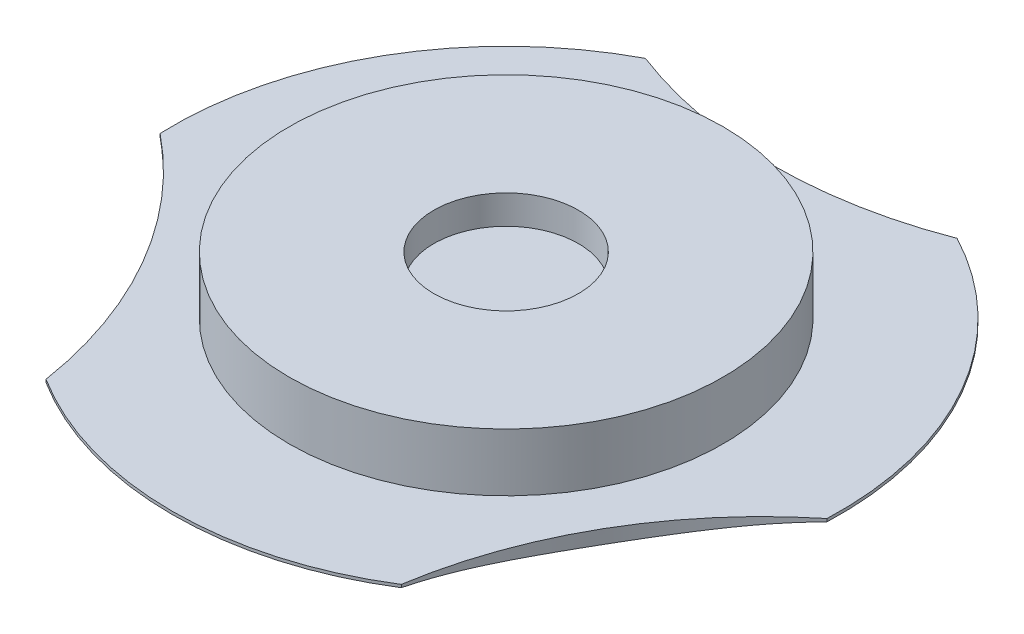
ISO-10303-21;
HEADER;
FILE_DESCRIPTION(('STEP AP214'),'2;1');
FILE_NAME('part.step','',(''),(''),'','','');
FILE_SCHEMA(('AUTOMOTIVE_DESIGN { 1 0 10303 214 1 1 1 1 }'));
ENDSEC;
DATA;
#1=APPLICATION_CONTEXT('core data for automotive mechanical design processes');
#2=APPLICATION_PROTOCOL_DEFINITION('international standard','automotive_design',2000,#1);
#3=PRODUCT_CONTEXT('',#1,'mechanical');
#4=PRODUCT('Part','Part','',(#3));
#5=PRODUCT_RELATED_PRODUCT_CATEGORY('part','',(#4));
#6=PRODUCT_DEFINITION_FORMATION('','',#4);
#7=PRODUCT_DEFINITION_CONTEXT('part definition',#1,'design');
#8=PRODUCT_DEFINITION('design','',#6,#7);
#9=PRODUCT_DEFINITION_SHAPE('','',#8);
#10=(LENGTH_UNIT() NAMED_UNIT(*) SI_UNIT(.MILLI.,.METRE.));
#11=(NAMED_UNIT(*) PLANE_ANGLE_UNIT() SI_UNIT($,.RADIAN.));
#12=(NAMED_UNIT(*) SI_UNIT($,.STERADIAN.) SOLID_ANGLE_UNIT());
#13=UNCERTAINTY_MEASURE_WITH_UNIT(LENGTH_MEASURE(1.E-05),#10,'distance_accuracy_value','');
#14=(GEOMETRIC_REPRESENTATION_CONTEXT(3) GLOBAL_UNCERTAINTY_ASSIGNED_CONTEXT((#13)) GLOBAL_UNIT_ASSIGNED_CONTEXT((#10,
#11,#12)) REPRESENTATION_CONTEXT('',''));
#15=CARTESIAN_POINT('',(0.,0.,0.));
#16=DIRECTION('',(0.,0.,1.));
#17=DIRECTION('',(1.,0.,0.));
#18=AXIS2_PLACEMENT_3D('',#15,#16,#17);
#19=CARTESIAN_POINT('',(0.,9.43352076152873,0.));
#20=DIRECTION('',(0.,1.,0.));
#21=DIRECTION('',(0.,0.,1.));
#22=AXIS2_PLACEMENT_3D('',#19,#20,#21);
#23=PLANE('',#22);
#24=CARTESIAN_POINT('',(0.,9.43352076152873,0.));
#25=DIRECTION('',(0.,1.,0.));
#26=DIRECTION('',(0.,0.,1.));
#27=AXIS2_PLACEMENT_3D('',#24,#25,#26);
#28=CIRCLE('',#27,7.5);
#29=CARTESIAN_POINT('',(0.,9.43352076152873,7.49999999999999));
#30=VERTEX_POINT('',#29);
#31=EDGE_CURVE('E255',#30,#30,#28,.T.);
#32=ORIENTED_EDGE('',*,*,#31,.F.);
#33=EDGE_LOOP('',(#32));
#34=FACE_BOUND('',#33,.T.);
#35=CARTESIAN_POINT('',(0.,9.43352076152873,0.));
#36=DIRECTION('',(0.,1.,0.));
#37=DIRECTION('',(0.,0.,1.));
#38=AXIS2_PLACEMENT_3D('',#35,#36,#37);
#39=CIRCLE('',#38,11.5356537528528);
#40=CARTESIAN_POINT('',(-11.5274658732935,9.43352076152873,0.434554997394507));
#41=VERTEX_POINT('',#40);
#42=CARTESIAN_POINT('',(-5.38739726956153,9.43352076152873,-10.2003557862276));
#43=VERTEX_POINT('',#42);
#44=EDGE_CURVE('E72',#41,#43,#39,.F.);
#45=ORIENTED_EDGE('',*,*,#44,.F.);
#46=CARTESIAN_POINT('',(-20.9573790351245,9.43352076152872,12.0997484274379));
#47=DIRECTION('',(0.,1.,0.));
#48=DIRECTION('',(0.,0.,1.));
#49=AXIS2_PLACEMENT_3D('',#46,#47,#48);
#50=CIRCLE('',#49,15.);
#51=CARTESIAN_POINT('',(-6.14006860373204,9.43352076152872,9.76580078883293));
#52=VERTEX_POINT('',#51);
#53=EDGE_CURVE('E243',#52,#41,#50,.T.);
#54=ORIENTED_EDGE('',*,*,#53,.F.);
#55=CARTESIAN_POINT('',(6.1400686037319,9.43352076152872,9.76580078883302));
#56=VERTEX_POINT('',#55);
#57=EDGE_CURVE('E183',#56,#52,#39,.F.);
#58=ORIENTED_EDGE('',*,*,#57,.F.);
#59=CARTESIAN_POINT('',(20.9573790351243,9.43352076152872,12.0997484274382));
#60=DIRECTION('',(0.,1.,0.));
#61=DIRECTION('',(0.,0.,1.));
#62=AXIS2_PLACEMENT_3D('',#59,#60,#61);
#63=CIRCLE('',#62,15.);
#64=CARTESIAN_POINT('',(11.5274658732935,9.43352076152873,0.434554997394667));
#65=VERTEX_POINT('',#64);
#66=EDGE_CURVE('E250',#65,#56,#63,.T.);
#67=ORIENTED_EDGE('',*,*,#66,.F.);
#68=CARTESIAN_POINT('',(5.38739726956153,9.43352076152873,-10.2003557862276));
#69=VERTEX_POINT('',#68);
#70=EDGE_CURVE('E188',#69,#65,#39,.F.);
#71=ORIENTED_EDGE('',*,*,#70,.F.);
#72=CARTESIAN_POINT('',(0.,9.43352076152874,-24.1994968548761));
#73=DIRECTION('',(0.,1.,0.));
#74=DIRECTION('',(0.,0.,1.));
#75=AXIS2_PLACEMENT_3D('',#72,#73,#74);
#76=CIRCLE('',#75,15.);
#77=EDGE_CURVE('E251',#43,#69,#76,.T.);
#78=ORIENTED_EDGE('',*,*,#77,.F.);
#79=EDGE_LOOP('',(#45,#54,#58,#67,#71,#78));
#80=FACE_BOUND('',#79,.T.);
#81=ADVANCED_FACE('F176',(#34,#80),#23,.T.);
#82=CARTESIAN_POINT('',(0.,45.3704428911622,0.));
#83=DIRECTION('',(0.,-1.,0.));
#84=DIRECTION('',(0.,0.,-1.));
#85=AXIS2_PLACEMENT_3D('',#82,#83,#84);
#86=CYLINDRICAL_SURFACE('',#85,7.5);
#87=ORIENTED_EDGE('',*,*,#31,.T.);
#88=EDGE_LOOP('',(#87));
#89=FACE_BOUND('',#88,.T.);
#90=CARTESIAN_POINT('',(0.,11.4335207615287,0.));
#91=DIRECTION('',(0.,1.,0.));
#92=DIRECTION('',(0.,0.,1.));
#93=AXIS2_PLACEMENT_3D('',#90,#91,#92);
#94=CIRCLE('',#93,7.5);
#95=CARTESIAN_POINT('',(0.,11.4335207615287,7.49999999999999));
#96=VERTEX_POINT('',#95);
#97=EDGE_CURVE('E294',#96,#96,#94,.T.);
#98=ORIENTED_EDGE('',*,*,#97,.F.);
#99=EDGE_LOOP('',(#98));
#100=FACE_BOUND('',#99,.T.);
#101=ADVANCED_FACE('F339',(#89,#100),#86,.T.);
#102=CARTESIAN_POINT('',(-3.11360126562325,7.937623113544,-3.13799643352642));
#103=CARTESIAN_POINT('',(-2.61542634530798,7.59724052872144,-3.13799643352642));
#104=CARTESIAN_POINT('',(-2.1172514249927,7.28839338581119,-3.13799643352642));
#105=CARTESIAN_POINT('',(-1.61907650467743,7.000845282462,-3.13799643352642));
#106=CARTESIAN_POINT('',(-0.871813057940758,6.67424847236847,-3.13799643352642));
#107=CARTESIAN_POINT('',(-0.124549611204089,6.58434688790549,-3.13799643352642));
#108=CARTESIAN_POINT('',(0.124538915217305,6.58434636163488,-3.13799643352642));
#109=CARTESIAN_POINT('',(0.871804494481487,6.67424522412291,-3.13799643352642));
#110=CARTESIAN_POINT('',(1.61907007374567,7.00084161506081,-3.13799643352642));
#111=CARTESIAN_POINT('',(2.11724712658846,7.28839070032714,-3.13799643352642));
#112=CARTESIAN_POINT('',(2.61542417943125,7.59723890276684,-3.13799643352642));
#113=CARTESIAN_POINT('',(3.11360123227403,7.93762288659672,-3.13799643352642));
#114=CARTESIAN_POINT('',(-3.11360126562325,7.59504891652239,-2.63613712455256));
#115=CARTESIAN_POINT('',(-2.61542634530798,7.19697722862648,-2.63613712455256));
#116=CARTESIAN_POINT('',(-2.1172514249927,6.83104483157861,-2.63613712455256));
#117=CARTESIAN_POINT('',(-1.61907650467743,6.48399326596545,-2.63613712455256));
#118=CARTESIAN_POINT('',(-0.871813057940758,6.08575802622804,-2.63613712455256));
#119=CARTESIAN_POINT('',(-0.124549611204089,5.9758528199001,-2.63613712455256));
#120=CARTESIAN_POINT('',(0.124538915217305,5.97585217939156,-2.63613712455256));
#121=CARTESIAN_POINT('',(0.871804494481487,6.085754074874,-2.63613712455256));
#122=CARTESIAN_POINT('',(1.61907007374567,6.48398876309058,-2.63613712455256));
#123=CARTESIAN_POINT('',(2.11724712658846,6.83104156445317,-2.63613712455256));
#124=CARTESIAN_POINT('',(2.61542417943125,7.19697532553092,-2.63613712455256));
#125=CARTESIAN_POINT('',(3.11360123227403,7.59504871584649,-2.63613712455256));
#126=CARTESIAN_POINT('',(-3.11360126562325,7.28142877047209,-2.1342778155787));
#127=CARTESIAN_POINT('',(-2.61542634530798,6.82613744470199,-2.1342778155787));
#128=CARTESIAN_POINT('',(-2.1172514249927,6.40393719997495,-2.1342778155787));
#129=CARTESIAN_POINT('',(-1.61907650467743,5.99571298774634,-2.1342778155787));
#130=CARTESIAN_POINT('',(-0.871813057940758,5.52287934500352,-2.1342778155787));
#131=CARTESIAN_POINT('',(-0.124549611204089,5.39216567050666,-2.1342778155787));
#132=CARTESIAN_POINT('',(0.124538915217305,5.39216493134301,-2.1342778155787));
#133=CARTESIAN_POINT('',(0.871804494481487,5.52287465308459,-2.1342778155787));
#134=CARTESIAN_POINT('',(1.61907007374567,5.99570762777393,-2.1342778155787));
#135=CARTESIAN_POINT('',(2.11724712658846,6.40393337351171,-2.1342778155787));
#136=CARTESIAN_POINT('',(2.61542417943125,6.82613526882366,-2.1342778155787));
#137=CARTESIAN_POINT('',(3.11360123227403,7.28142868013361,-2.1342778155787));
#138=CARTESIAN_POINT('',(-3.11360126562325,6.98662054266186,-1.63241850660484));
#139=CARTESIAN_POINT('',(-2.61542634530798,6.47112654113163,-1.63241850660484));
#140=CARTESIAN_POINT('',(-2.1172514249927,5.98724363827097,-1.63241850660484));
#141=CARTESIAN_POINT('',(-1.61907650467743,5.51234872423166,-1.63241850660484));
#142=CARTESIAN_POINT('',(-0.871813057940758,4.97060643439688,-1.63241850660484));
#143=CARTESIAN_POINT('',(-0.124549611204089,4.81849264631775,-1.63241850660484));
#144=CARTESIAN_POINT('',(0.124538915217305,4.8184917534154,-1.63241850660484));
#145=CARTESIAN_POINT('',(0.871804494481487,4.97060105523037,-1.63241850660484));
#146=CARTESIAN_POINT('',(1.61907007374567,5.51234239088727,-1.63241850660484));
#147=CARTESIAN_POINT('',(2.11724712658846,5.98723938606817,-1.63241850660484));
#148=CARTESIAN_POINT('',(2.61542417943125,6.47112451840757,-1.63241850660484));
#149=CARTESIAN_POINT('',(3.11360123227403,6.98662079092823,-1.63241850660484));
#150=CARTESIAN_POINT('',(-3.11360126562325,6.64957359545626,-0.879629543144051));
#151=CARTESIAN_POINT('',(-2.61542634530798,6.06063612358645,-0.879629543144051));
#152=CARTESIAN_POINT('',(-2.1172514249927,5.50094406891031,-0.879629543144051));
#153=CARTESIAN_POINT('',(-1.61907650467743,4.95519001196715,-0.879629543144051));
#154=CARTESIAN_POINT('',(-0.871813057940758,4.28175912783596,-0.879629543144051));
#155=CARTESIAN_POINT('',(-0.124549611204089,4.08986241601543,-0.879629543144051));
#156=CARTESIAN_POINT('',(0.124538915217305,4.08986133013182,-0.879629543144051));
#157=CARTESIAN_POINT('',(0.871804494481487,4.28175220249054,-0.879629543144051));
#158=CARTESIAN_POINT('',(1.61907007374567,4.95518272245078,-0.879629543144051));
#159=CARTESIAN_POINT('',(2.11724712658846,5.50093942186458,-0.879629543144051));
#160=CARTESIAN_POINT('',(2.61542417943125,6.06063354280388,-0.879629543144051));
#161=CARTESIAN_POINT('',(3.11360123227403,6.64957347075905,-0.879629543144051));
#162=CARTESIAN_POINT('',(-3.11360126562325,6.55618552691207,-0.126840579683261));
#163=CARTESIAN_POINT('',(-2.61542634530798,5.94527238698926,-0.126840579683261));
#164=CARTESIAN_POINT('',(-2.1172514249927,5.36268776447394,-0.126840579683261));
#165=CARTESIAN_POINT('',(-1.61907650467743,4.79383981524938,-0.126840579683261));
#166=CARTESIAN_POINT('',(-0.871813057940758,4.07694026263187,-0.126840579683261));
#167=CARTESIAN_POINT('',(-0.124549611204089,3.85473666423939,-0.126840579683261));
#168=CARTESIAN_POINT('',(0.124538915217305,3.85473528796918,-0.126840579683261));
#169=CARTESIAN_POINT('',(0.871804494481487,4.076932728122,-0.126840579683261));
#170=CARTESIAN_POINT('',(1.61907007374567,4.79383232042963,-0.126840579683261));
#171=CARTESIAN_POINT('',(2.11724712658846,5.36268272794387,-0.126840579683261));
#172=CARTESIAN_POINT('',(2.61542417943125,5.94526974853238,-0.126840579683261));
#173=CARTESIAN_POINT('',(3.11360123227403,6.55618549533082,-0.126840579683261));
#174=CARTESIAN_POINT('',(-3.11360126562325,6.55609684157066,0.124089074803669));
#175=CARTESIAN_POINT('',(-2.61542634530798,5.94454426095569,0.124089074803669));
#176=CARTESIAN_POINT('',(-2.1172514249927,5.36136717941806,0.124089074803669));
#177=CARTESIAN_POINT('',(-1.61907650467743,4.79169409054885,0.124089074803669));
#178=CARTESIAN_POINT('',(-0.871813057940758,4.07382722363082,0.124089074803669));
#179=CARTESIAN_POINT('',(-0.12454961120409,3.85057259866754,0.124089074803669));
#180=CARTESIAN_POINT('',(0.124538915217305,3.85057120605239,0.124089074803669));
#181=CARTESIAN_POINT('',(0.871804494481487,4.07381969315282,0.124089074803669));
#182=CARTESIAN_POINT('',(1.61907007374567,4.79168655148878,0.124089074803669));
#183=CARTESIAN_POINT('',(2.11724712658846,5.3613621883294,0.124089074803669));
#184=CARTESIAN_POINT('',(2.61542417943125,5.9445416145618,0.124089074803669));
#185=CARTESIAN_POINT('',(3.11360123227403,6.55609678045078,0.124089074803669));
#186=CARTESIAN_POINT('',(-3.11360126562325,6.64904351904959,0.872889284920727));
#187=CARTESIAN_POINT('',(-2.61542634530798,6.05571108757478,0.872889284920727));
#188=CARTESIAN_POINT('',(-2.1172514249927,5.49137521736159,0.872889284920727));
#189=CARTESIAN_POINT('',(-1.61907650467743,4.94103491973095,0.872889284920727));
#190=CARTESIAN_POINT('',(-0.871813057940759,4.25944945414356,0.872889284920727));
#191=CARTESIAN_POINT('',(-0.12454961120409,4.06465095540626,0.872889284920727));
#192=CARTESIAN_POINT('',(0.124538915217304,4.0646498509368,0.872889284920727));
#193=CARTESIAN_POINT('',(0.871804494481487,4.25944241788699,0.872889284920727));
#194=CARTESIAN_POINT('',(1.61907007374567,4.94102761372968,0.872889284920727));
#195=CARTESIAN_POINT('',(2.11724712658846,5.49137032788645,0.872889284920727));
#196=CARTESIAN_POINT('',(2.61542417943125,6.05570854726112,0.872889284920727));
#197=CARTESIAN_POINT('',(3.11360123227403,6.64904352911799,0.872889284920727));
#198=CARTESIAN_POINT('',(-3.11360126562325,6.98719030370924,1.62168949503779));
#199=CARTESIAN_POINT('',(-2.61542634530798,6.46364643369561,1.62168949503779));
#200=CARTESIAN_POINT('',(-2.1172514249927,5.97167244969741,1.62168949503779));
#201=CARTESIAN_POINT('',(-1.61907650467743,5.48791800590051,1.62168949503779));
#202=CARTESIAN_POINT('',(-0.871813057940759,4.93506358972752,1.62168949503779));
#203=CARTESIAN_POINT('',(-0.12454961120409,4.77983457477378,1.62168949503779));
#204=CARTESIAN_POINT('',(0.124538915217304,4.77983367764913,1.62168949503779));
#205=CARTESIAN_POINT('',(0.871804494481487,4.93505809335462,1.62168949503779));
#206=CARTESIAN_POINT('',(1.61907007374567,5.48791156889603,1.62168949503779));
#207=CARTESIAN_POINT('',(2.11724712658846,5.97166821206818,1.62168949503779));
#208=CARTESIAN_POINT('',(2.61542417943125,6.4636440919047,1.62168949503779));
#209=CARTESIAN_POINT('',(3.11360123227403,6.98719018323561,1.62168949503779));
#210=CARTESIAN_POINT('',(-3.11360126562325,7.28489337990906,2.11956005066791));
#211=CARTESIAN_POINT('',(-2.61542634530798,6.81975043868102,2.11956005066791));
#212=CARTESIAN_POINT('',(-2.1172514249927,6.38786250149728,2.11956005066791));
#213=CARTESIAN_POINT('',(-1.61907650467743,5.9695906499434,2.11956005066791));
#214=CARTESIAN_POINT('',(-0.871813057940759,5.48507831255403,2.11956005066791));
#215=CARTESIAN_POINT('',(-0.12454961120409,5.35084375184689,2.11956005066791));
#216=CARTESIAN_POINT('',(0.124538915217304,5.35084292262855,2.11956005066791));
#217=CARTESIAN_POINT('',(0.871804494481487,5.48507350251821,2.11956005066791));
#218=CARTESIAN_POINT('',(1.61907007374567,5.96958525618739,2.11956005066791));
#219=CARTESIAN_POINT('',(2.11724712658846,6.38785879381362,2.11956005066791));
#220=CARTESIAN_POINT('',(2.61542417943125,6.81974844659845,2.11956005066791));
#221=CARTESIAN_POINT('',(3.11360123227403,7.28489327877417,2.11956005066791));
#222=CARTESIAN_POINT('',(-3.11360126562325,7.60726055939484,2.61743060629804));
#223=CARTESIAN_POINT('',(-2.61542634530798,7.19820793893451,2.61743060629804));
#224=CARTESIAN_POINT('',(-2.1172514249927,6.82157727797017,2.61743060629804));
#225=CARTESIAN_POINT('',(-1.61907650467743,6.46382083777974,2.61743060629804));
#226=CARTESIAN_POINT('',(-0.871813057940758,6.05295368857926,2.61743060629804));
#227=CARTESIAN_POINT('',(-0.12454961120409,5.93951638039541,2.61743060629804));
#228=CARTESIAN_POINT('',(0.124538915217305,5.93951570863097,2.61743060629804));
#229=CARTESIAN_POINT('',(0.871804494481487,6.05294930250404,2.61743060629804));
#230=CARTESIAN_POINT('',(1.61907007374567,6.46381624962606,2.61743060629804));
#231=CARTESIAN_POINT('',(2.11724712658846,6.82157422303054,2.61743060629804));
#232=CARTESIAN_POINT('',(2.61542417943125,7.19820630738128,2.61743060629804));
#233=CARTESIAN_POINT('',(3.11360123227403,7.60726059904454,2.61743060629804));
#234=CARTESIAN_POINT('',(-3.11360126562325,7.96463019577989,3.11530116192817));
#235=CARTESIAN_POINT('',(-2.61542634530798,7.61225486290375,3.11530116192817));
#236=CARTESIAN_POINT('',(-2.1172514249927,7.29183034804258,3.11530116192817));
#237=CARTESIAN_POINT('',(-1.61907650467743,6.99324917863655,3.11530116192817));
#238=CARTESIAN_POINT('',(-0.871813057940758,6.65382722284382,3.11530116192817));
#239=CARTESIAN_POINT('',(-0.124549611204089,6.56046039965776,3.11530116192817));
#240=CARTESIAN_POINT('',(0.124538915217305,6.56045982966153,3.11530116192817));
#241=CARTESIAN_POINT('',(0.871804494481487,6.65382337659068,3.11530116192817));
#242=CARTESIAN_POINT('',(1.61907007374567,6.99324513593723,3.11530116192817));
#243=CARTESIAN_POINT('',(2.11724712658846,7.29182791148918,3.11530116192817));
#244=CARTESIAN_POINT('',(2.61542417943125,7.6122535860403,3.11530116192817));
#245=CARTESIAN_POINT('',(3.11360123227403,7.96463036922525,3.11530116192817));
#246=B_SPLINE_SURFACE_WITH_KNOTS('',5,5,((#102,#103,#104,#105,#106,#107,#108,#109,#110,#111,
#112,#113),(#114,#115,#116,#117,#118,#119,#120,#121,#122,#123,#124,#125),(#126,#127,#128,#129,
#130,#131,#132,#133,#134,#135,#136,#137),(#138,#139,#140,#141,#142,#143,#144,#145,#146,#147,
#148,#149),(#150,#151,#152,#153,#154,#155,#156,#157,#158,#159,#160,#161),(#162,#163,#164,#165,
#166,#167,#168,#169,#170,#171,#172,#173),(#174,#175,#176,#177,#178,#179,#180,#181,#182,#183,
#184,#185),(#186,#187,#188,#189,#190,#191,#192,#193,#194,#195,#196,#197),(#198,#199,#200,#201,
#202,#203,#204,#205,#206,#207,#208,#209),(#210,#211,#212,#213,#214,#215,#216,#217,#218,#219,
#220,#221),(#222,#223,#224,#225,#226,#227,#228,#229,#230,#231,#232,#233),(#234,#235,#236,#237,
#238,#239,#240,#241,#242,#243,#244,#245)),.UNSPECIFIED.,.F.,.F.,.F.,(6,3,3,6),(6,3,3,6),
(-2.99588678556527,-0.486590240695972,0.768058031738678,3.25741080988932),(-3.11360126562325,
-0.622726664046877,0.622715968060093,3.11360123227403),.UNSPECIFIED.);
#247=CARTESIAN_POINT('',(-6.94502371193992E-11,6.43361939260252,3.00015914966676));
#248=CARTESIAN_POINT('',(-0.168369170775696,6.43362383102677,3.00015646468615));
#249=CARTESIAN_POINT('',(-0.336880059908865,6.43370980999841,2.98608167683183));
#250=CARTESIAN_POINT('',(-0.669220786115052,6.4336910015602,2.9295517235223));
#251=CARTESIAN_POINT('',(-0.833044431640659,6.43358597267979,2.88706067740758));
#252=CARTESIAN_POINT('',(-1.15131328393748,6.43355621421522,2.77547176266421));
#253=CARTESIAN_POINT('',(-1.30576084611601,6.43363143915491,2.70638060865471));
#254=CARTESIAN_POINT('',(-1.60086526166447,6.433813151013,2.54331745740612));
#255=CARTESIAN_POINT('',(-1.74152699255679,6.43391962682098,2.44935430391519));
#256=CARTESIAN_POINT('',(-2.00544094374606,6.4340440157865,2.23872522279229));
#257=CARTESIAN_POINT('',(-2.12863265052798,6.43406162808246,2.12198355826804));
#258=CARTESIAN_POINT('',(-2.35353370996981,6.43399608798819,1.86923991601341));
#259=CARTESIAN_POINT('',(-2.45524058455651,6.43391292398181,1.73323571955002));
#260=CARTESIAN_POINT('',(-2.58910740509711,6.43376334503043,1.51853637696536));
#261=CARTESIAN_POINT('',(-2.63050890355568,6.43370956246539,1.44544397841132));
#262=CARTESIAN_POINT('',(-2.70707883089785,6.43361878736176,1.29603577714827));
#263=CARTESIAN_POINT('',(-2.74224697966097,6.43358179557763,1.21971982976695));
#264=CARTESIAN_POINT('',(-2.8061144923863,6.43354658811171,1.06443578443451));
#265=CARTESIAN_POINT('',(-2.83481389827214,6.43354837217862,0.985467703675555));
#266=CARTESIAN_POINT('',(-2.88556035475395,6.43359694530224,0.825423843270878));
#267=CARTESIAN_POINT('',(-2.90760782317445,6.43364373153149,0.744348196354168));
#268=CARTESIAN_POINT('',(-2.94494205571929,6.43369590411284,0.57982445203915));
#269=CARTESIAN_POINT('',(-2.96016114337415,6.43370088434751,0.496360967700022));
#270=CARTESIAN_POINT('',(-2.98343141041526,6.43368067229352,0.328437177996661));
#271=CARTESIAN_POINT('',(-2.9914820779879,6.43365547785073,0.243976801892132));
#272=CARTESIAN_POINT('',(-3.00043799162693,6.43362629140429,0.0746859250085986));
#273=CARTESIAN_POINT('',(-3.00134377699354,6.4336222978004,-0.010144547351685));
#274=CARTESIAN_POINT('',(-2.99601348476975,6.43364069694652,-0.179577268130175));
#275=CARTESIAN_POINT('',(-2.98977776693827,6.43366308836737,-0.264179527829582));
#276=CARTESIAN_POINT('',(-2.97020828984775,6.43369960736705,-0.432085946574098));
#277=CARTESIAN_POINT('',(-2.95691410035748,6.4337137801021,-0.515394703292947));
#278=CARTESIAN_POINT('',(-2.92326982957729,6.43368445389916,-0.680575335776372));
#279=CARTESIAN_POINT('',(-2.90291963896245,6.43364095406756,-0.762447189257069));
#280=CARTESIAN_POINT('',(-2.85543582486922,6.43357852626571,-0.924202810711122));
#281=CARTESIAN_POINT('',(-2.82830172745974,6.43355960001277,-1.00408643935603));
#282=CARTESIAN_POINT('',(-2.767460936624,6.43355959906242,-1.16131058073196));
#283=CARTESIAN_POINT('',(-2.73375416881041,6.43357852479344,-1.23865106466893));
#284=CARTESIAN_POINT('',(-2.6599248012581,6.43363495279813,-1.39033292215802));
#285=CARTESIAN_POINT('',(-2.61979428743556,6.4336724781077,-1.46467045271417));
#286=CARTESIAN_POINT('',(-2.53342412553487,6.43374583027833,-1.60968088216829));
#287=CARTESIAN_POINT('',(-2.48718461178627,6.43378165717672,-1.68035386159777));
#288=CARTESIAN_POINT('',(-2.33976745848653,6.43386854350985,-1.88606877407902));
#289=CARTESIAN_POINT('',(-2.22981213923912,6.43389912756561,-2.01496891587683));
#290=CARTESIAN_POINT('',(-1.98997076544583,6.43388747287063,-2.25209813061941));
#291=CARTESIAN_POINT('',(-1.86012748319679,6.43384538845571,-2.36037047152253));
#292=CARTESIAN_POINT('',(-1.65324506966376,6.43374435323986,-2.50520759683785));
#293=CARTESIAN_POINT('',(-1.58222435561476,6.43370432586084,-2.55057720211393));
#294=CARTESIAN_POINT('',(-1.43660189050449,6.43362560105556,-2.63519879666057));
#295=CARTESIAN_POINT('',(-1.36200003685486,6.43358690366745,-2.67445061053875));
#296=CARTESIAN_POINT('',(-1.20977690174887,6.43353229448477,-2.74657027202948));
#297=CARTESIAN_POINT('',(-1.13215555255035,6.4335163832017,-2.77943797631578));
#298=CARTESIAN_POINT('',(-0.974445240211905,6.43352711865217,-2.8385929432336));
#299=CARTESIAN_POINT('',(-0.89435632217277,6.43355376460833,-2.86488032605641));
#300=CARTESIAN_POINT('',(-0.732262239419173,6.43362610623149,-2.91065349587264));
#301=CARTESIAN_POINT('',(-0.650257241494113,6.4336718002462,-2.93013987253867));
#302=CARTESIAN_POINT('',(-0.484884654489438,6.43370375186627,-2.96205165670812));
#303=CARTESIAN_POINT('',(-0.401517076376356,6.43369000994976,-2.97447712101154));
#304=CARTESIAN_POINT('',(-0.233844016177246,6.43365819843116,-2.99228539772667));
#305=CARTESIAN_POINT('',(-0.149536831747488,6.433640119054,-2.9976521226327));
#306=CARTESIAN_POINT('',(0.0192331728791341,6.43362837747091,-3.0012991180094));
#307=CARTESIAN_POINT('',(0.103695998473748,6.43363471612838,-2.99957913790199));
#308=CARTESIAN_POINT('',(0.272188501261583,6.43366444058375,-2.98905172388241));
#309=CARTESIAN_POINT('',(0.356218137385125,6.43368782796913,-2.98024362996207));
#310=CARTESIAN_POINT('',(0.523221351606214,6.4336959385228,-2.9555135588791));
#311=CARTESIAN_POINT('',(0.606194985864221,6.43368066375594,-2.93959196166763));
#312=CARTESIAN_POINT('',(0.77031600539346,6.43361746182137,-2.90080068871673));
#313=CARTESIAN_POINT('',(0.851466845422279,6.43356960297129,-2.87794560559383));
#314=CARTESIAN_POINT('',(1.01158499881486,6.43351833648994,-2.82555652758814));
#315=CARTESIAN_POINT('',(1.09055218251607,6.43351493149263,-2.79602213704876));
#316=CARTESIAN_POINT('',(1.24575164558354,6.43354118725682,-2.7304565824644));
#317=CARTESIAN_POINT('',(1.32198387157045,6.43357084866333,-2.69442529169923));
#318=CARTESIAN_POINT('',(1.47113703606307,6.43364253975297,-2.61611173383177));
#319=CARTESIAN_POINT('',(1.54405811955472,6.43368456889395,-2.57382974077648));
#320=CARTESIAN_POINT('',(1.75789628963021,6.43379884023082,-2.43744141731617));
#321=CARTESIAN_POINT('',(1.89309867163244,6.43385872101653,-2.33412600645003));
#322=CARTESIAN_POINT('',(2.14397518658921,6.43390691114347,-2.10615071433049));
#323=CARTESIAN_POINT('',(2.25965099157898,6.43389522661594,-1.98149266246259));
#324=CARTESIAN_POINT('',(2.46741310128317,6.43380198766058,-1.71547426474254));
#325=CARTESIAN_POINT('',(2.55967979579334,6.43372098996606,-1.57425472195432));
#326=CARTESIAN_POINT('',(2.71934573085664,6.43358786317583,-1.27829957310436));
#327=CARTESIAN_POINT('',(2.78674205149007,6.43353573746949,-1.12356238263174));
#328=CARTESIAN_POINT('',(2.86804808108599,6.43359059929686,-0.88439678823389));
#329=CARTESIAN_POINT('',(2.89189820028409,6.43363142336946,-0.803215062104474));
#330=CARTESIAN_POINT('',(2.93263033377643,6.43368961151593,-0.63910244014185));
#331=CARTESIAN_POINT('',(2.9495127743549,6.43370697702516,-0.55617165164308));
#332=CARTESIAN_POINT('',(2.97613782598099,6.43369792549036,-0.389186214165083));
#333=CARTESIAN_POINT('',(2.9858815629239,6.43367151535265,-0.30513174453976));
#334=CARTESIAN_POINT('',(2.99826790029465,6.43363342825057,-0.136519724864124));
#335=CARTESIAN_POINT('',(3.00090991587101,6.43362175249966,-0.0519621339546855));
#336=CARTESIAN_POINT('',(2.99817080252219,6.43363769780586,0.201047403282739));
#337=CARTESIAN_POINT('',(2.98223263948975,6.43371578232951,0.369524086389343));
#338=CARTESIAN_POINT('',(2.92202396406839,6.43367861211234,0.701263946940477));
#339=CARTESIAN_POINT('',(2.87774883780424,6.43356332588158,0.864526270827875));
#340=CARTESIAN_POINT('',(2.76273458109817,6.43354281165466,1.18149375109606));
#341=CARTESIAN_POINT('',(2.69198958418181,6.43363763024663,1.33519678005265));
#342=CARTESIAN_POINT('',(2.52573167655752,6.4338365954944,1.6285447522828));
#343=CARTESIAN_POINT('',(2.43022391139332,6.43394074020936,1.76819260777212));
#344=CARTESIAN_POINT('',(2.21673760501513,6.43405246809654,2.02972516685341));
#345=CARTESIAN_POINT('',(2.09870120686194,6.43405979915759,2.15156267613183));
#346=CARTESIAN_POINT('',(1.84370527168266,6.43397885181704,2.3735607470722));
#347=CARTESIAN_POINT('',(1.70673868195518,6.43389053769728,2.47371319380807));
#348=CARTESIAN_POINT('',(1.41870609626607,6.433699362297,2.64900246012069));
#349=CARTESIAN_POINT('',(1.2677311363148,6.43359659297405,2.72428804741727));
#350=CARTESIAN_POINT('',(1.0337429076892,6.43356193238631,2.81759645740828));
#351=CARTESIAN_POINT('',(0.954502245154836,6.43357028645818,2.84542715649324));
#352=CARTESIAN_POINT('',(0.793990048328266,6.4336236516749,2.89440959854277));
#353=CARTESIAN_POINT('',(0.7127191335733,6.43366865176643,2.91556335276689));
#354=CARTESIAN_POINT('',(0.527163258784683,6.43371128839331,2.95552900873719));
#355=CARTESIAN_POINT('',(0.422426322443649,6.4336934305232,2.97227599211699));
#356=CARTESIAN_POINT('',(0.211811624638008,6.43364608635444,2.99459190908999));
#357=CARTESIAN_POINT('',(0.105933862796739,6.43361660005194,3.00016083899247));
#358=CARTESIAN_POINT('',(-6.94502371193992E-11,6.43361939260252,3.00015914966676));
#359=B_SPLINE_CURVE_WITH_KNOTS('',3,(#247,#248,#249,#250,#251,#252,#253,#254,#255,#256,#257,
#258,#259,#260,#261,#262,#263,#264,#265,#266,#267,#268,#269,#270,#271,#272,#273,#274,#275,#276,
#277,#278,#279,#280,#281,#282,#283,#284,#285,#286,#287,#288,#289,#290,#291,#292,#293,#294,#295,
#296,#297,#298,#299,#300,#301,#302,#303,#304,#305,#306,#307,#308,#309,#310,#311,#312,#313,#314,
#315,#316,#317,#318,#319,#320,#321,#322,#323,#324,#325,#326,#327,#328,#329,#330,#331,#332,#333,
#334,#335,#336,#337,#338,#339,#340,#341,#342,#343,#344,#345,#346,#347,#348,#349,#350,#351,#352,
#353,#354,#355,#356,#357,#358),.UNSPECIFIED.,.T.,.F.,(4,2,2,2,2,2,2,2,2,2,2,2,2,2,2,2,2,2,2,2,2,
2,2,2,2,2,2,2,2,2,2,2,2,2,2,2,2,2,2,2,2,2,2,2,2,2,2,2,2,2,2,2,2,2,2,4),(0.,0.504723124935217,
1.01008476031984,1.51531891169458,2.02037365749019,2.52713720458864,3.03395917021713,
3.28572917315788,3.53751048752236,3.78929017005622,4.04105403439574,4.29526082045904,
4.54948575502081,4.80369150033989,5.05788444040514,5.31066719260193,5.56345386156314,
5.81625819541266,6.06906539058499,6.32218647708965,6.57530199869233,7.08099854655981,
7.58562239905072,7.83819871533201,8.09078227145099,8.34337149753414,8.59595610967301,
8.84851881634047,9.10107949129303,9.354214783159,9.60735902568674,9.86052684241325,
10.1136811383884,10.3663062846735,10.618946399426,10.8715914423849,11.1242254120131,
11.6320320201322,12.1397951233548,12.6435176748761,13.1472993474142,13.4008907080642,
13.6544665516344,13.9080023933558,14.1615591139968,14.6666089740455,15.1717410881467,
15.676985220235,16.1821244498705,16.6885788473215,17.1952224424719,17.6987776608386,
17.9504963712117,18.2021391852144,18.5196988217225,18.8372585630813),.UNSPECIFIED.);
#360=CARTESIAN_POINT('',(-6.94502371193992E-11,6.43361939260252,3.00015914966676));
#361=VERTEX_POINT('',#360);
#362=EDGE_CURVE('E237',#361,#361,#359,.T.);
#363=ORIENTED_EDGE('',*,*,#362,.T.);
#364=EDGE_LOOP('',(#363));
#365=FACE_BOUND('',#364,.T.);
#366=ADVANCED_FACE('F178',(#365),#246,.F.);
#367=CARTESIAN_POINT('',(20.9573790351243,45.3704428911622,12.0997484274382));
#368=DIRECTION('',(0.,-1.,0.));
#369=DIRECTION('',(0.,0.,-1.));
#370=AXIS2_PLACEMENT_3D('',#367,#368,#369);
#371=CYLINDRICAL_SURFACE('',#370,15.);
#372=DIRECTION('',(0.,1.,0.));
#373=VECTOR('',#372,1.);
#374=CARTESIAN_POINT('',(11.5274658732935,9.43352076152872,0.434554997394667));
#375=LINE('',#374,#373);
#376=CARTESIAN_POINT('',(11.5274658732935,9.33326950366107,0.434554997394667));
#377=VERTEX_POINT('',#376);
#378=EDGE_CURVE('E314',#65,#377,#375,.F.);
#379=ORIENTED_EDGE('',*,*,#378,.F.);
#380=ORIENTED_EDGE('',*,*,#66,.T.);
#381=DIRECTION('',(0.,1.,0.));
#382=VECTOR('',#381,1.);
#383=CARTESIAN_POINT('',(6.1400686037319,9.43352076152872,9.76580078883302));
#384=LINE('',#383,#382);
#385=CARTESIAN_POINT('',(6.1400686037319,9.33326950366107,9.76580078883303));
#386=VERTEX_POINT('',#385);
#387=EDGE_CURVE('E203',#386,#56,#384,.T.);
#388=ORIENTED_EDGE('',*,*,#387,.F.);
#389=CARTESIAN_POINT('',(6.0262839147282,9.39244979725994,13.5358537528528));
#390=CARTESIAN_POINT('',(6.01128961449766,9.40198489494914,13.3799697800387));
#391=CARTESIAN_POINT('',(5.99873045992406,9.40978818762599,13.2237626009109));
#392=CARTESIAN_POINT('',(5.97850785361815,9.42207628700767,12.9109114596059));
#393=CARTESIAN_POINT('',(5.97084407531528,9.4265613150771,12.7542675272649));
#394=CARTESIAN_POINT('',(5.95524081957254,9.4352529600441,12.2842474385515));
#395=CARTESIAN_POINT('',(5.95466220555217,9.4347128608842,11.9705001691947));
#396=CARTESIAN_POINT('',(5.97314644565783,9.42258997276146,11.3442003404481));
#397=CARTESIAN_POINT('',(5.99218752844789,9.41101942499124,11.0316468422596));
#398=CARTESIAN_POINT('',(6.0497178646465,9.37902434872686,10.4087427404569));
#399=CARTESIAN_POINT('',(6.08821159851632,9.35859778061048,10.0983926610554));
#400=CARTESIAN_POINT('',(6.19300239295282,9.30740819313663,9.42604547103153));
#401=CARTESIAN_POINT('',(6.26303633272641,9.27545084923699,9.06471984677453));
#402=CARTESIAN_POINT('',(6.42937113388596,9.20841693686163,8.3484506663943));
#403=CARTESIAN_POINT('',(6.5256757724867,9.17333992032693,7.99350803584976));
#404=CARTESIAN_POINT('',(6.74403544247583,9.10635348720617,7.2918825146135));
#405=CARTESIAN_POINT('',(6.8660490826604,9.07443909881937,6.94518733229255));
#406=CARTESIAN_POINT('',(7.06809492240461,9.0335364632275,6.43215743894857));
#407=CARTESIAN_POINT('',(7.13861911622986,9.0210632165406,6.26230655319823));
#408=CARTESIAN_POINT('',(7.28593966015845,8.99909528286948,5.92515705225083));
#409=CARTESIAN_POINT('',(7.36273546551659,8.98960033753939,5.75785821688042));
#410=CARTESIAN_POINT('',(7.53328921451398,8.97308385984993,5.40366857527308));
#411=CARTESIAN_POINT('',(7.62793747241729,8.96656924469757,5.21718167659707));
#412=CARTESIAN_POINT('',(7.82499982928813,8.95856260270069,4.84824139845565));
#413=CARTESIAN_POINT('',(7.92741405747023,8.95707065944496,4.66578808616859));
#414=CARTESIAN_POINT('',(8.13978463447986,8.95922328791004,4.30532493502681));
#415=CARTESIAN_POINT('',(8.24974193932872,8.96286851187193,4.12731566333079));
#416=CARTESIAN_POINT('',(8.47692219961346,8.97501920919147,3.77617173807198));
#417=CARTESIAN_POINT('',(8.59414516016357,8.98352468597024,3.6030370879405));
#418=CARTESIAN_POINT('',(8.8359346199284,9.00479720455913,3.26150867500639));
#419=CARTESIAN_POINT('',(8.96052092773012,9.01757621653025,3.09312968573713));
#420=CARTESIAN_POINT('',(9.21647337855296,9.0464802784466,2.76192464594341));
#421=CARTESIAN_POINT('',(9.34783966038926,9.06260539692142,2.5990987092272));
#422=CARTESIAN_POINT('',(9.75180541421736,9.11438956103154,2.11927239707273));
#423=CARTESIAN_POINT('',(10.0343083176563,9.15346123770393,1.81087197088273));
#424=CARTESIAN_POINT('',(10.5672198216793,9.22390372823269,1.27576970626853));
#425=CARTESIAN_POINT('',(10.8133460824933,9.25530987479146,1.04476518793413));
#426=CARTESIAN_POINT('',(11.3208791691144,9.31341728025744,0.599676324140031));
#427=CARTESIAN_POINT('',(11.5822788266523,9.34012072303703,0.385584150421994));
#428=CARTESIAN_POINT('',(11.9844825320344,9.37370461295173,0.0782903885080129));
#429=CARTESIAN_POINT('',(12.1199344780521,9.38380597523135,-0.0216346919544864));
#430=CARTESIAN_POINT('',(12.3942385833853,9.40148951138146,-0.216946146628558));
#431=CARTESIAN_POINT('',(12.5330906455817,9.40907175711676,-0.312332650249148));
#432=CARTESIAN_POINT('',(12.8141653017897,9.42135535120843,-0.498525818957988));
#433=CARTESIAN_POINT('',(12.9563912414775,9.42605370415365,-0.589327632562548));
#434=CARTESIAN_POINT('',(13.2438903981042,9.43225091934366,-0.766120836592149));
#435=CARTESIAN_POINT('',(13.3891639423973,9.43374943608728,-0.852111706581225));
#436=CARTESIAN_POINT('',(13.5358537528528,9.43349435916257,-0.935625080237196));
#437=B_SPLINE_CURVE_WITH_KNOTS('',3,(#389,#390,#391,#392,#393,#394,#395,#396,#397,#398,#399,
#400,#401,#402,#403,#404,#405,#406,#407,#408,#409,#410,#411,#412,#413,#414,#415,#416,#417,#418,
#419,#420,#421,#422,#423,#424,#425,#426,#427,#428,#429,#430,#431,#432,#433,#434,#435,#436),
.UNSPECIFIED.,.F.,.F.,(4,2,2,2,2,2,2,2,2,2,2,2,2,2,2,2,2,2,2,2,2,2,2,4),(0.,0.470619701152225,
0.941208003982719,1.88153293904296,2.82081554883227,3.76031459897942,4.8675464620346,
5.97493760745103,7.08055930533499,7.63343486814766,8.18626245977543,8.81371750435827,
9.44118299118312,10.0687281514195,10.6962737533835,11.3255920404338,11.9549232174463,
13.213396330837,14.229744819355,15.2456200775337,15.7514018113945,16.2571691151839,
16.7634608589577,17.2698072666372),.UNSPECIFIED.);
#438=EDGE_CURVE('E263',#386,#377,#437,.T.);
#439=ORIENTED_EDGE('',*,*,#438,.T.);
#440=EDGE_LOOP('',(#379,#380,#388,#439));
#441=FACE_BOUND('',#440,.T.);
#442=ADVANCED_FACE('F278',(#441),#371,.F.);
#443=CARTESIAN_POINT('',(0.,-10.5664792384713,0.));
#444=DIRECTION('',(0.,-1.,0.));
#445=DIRECTION('',(0.,0.,-1.));
#446=AXIS2_PLACEMENT_3D('',#443,#444,#445);
#447=DEGENERATE_TOROIDAL_SURFACE('',#446,13.5356537528528,20.,.T.);
#448=ORIENTED_EDGE('',*,*,#362,.F.);
#449=EDGE_LOOP('',(#448));
#450=FACE_BOUND('',#449,.T.);
#451=CARTESIAN_POINT('',(10.5492519067785,9.10216507754264,-13.5358537528528));
#452=CARTESIAN_POINT('',(10.4196381332204,9.13550199790529,-13.4076229378361));
#453=CARTESIAN_POINT('',(10.2873429856801,9.16624605541725,-13.2814303954038));
#454=CARTESIAN_POINT('',(10.0176312640631,9.22258497097764,-13.0334509092939));
#455=CARTESIAN_POINT('',(9.88021478554323,9.24817992504406,-12.9116638834991));
#456=CARTESIAN_POINT('',(9.60058543430057,9.29424381142763,-12.6728952989181));
#457=CARTESIAN_POINT('',(9.45837565390807,9.31471597944092,-12.5559107459927));
#458=CARTESIAN_POINT('',(9.16936447001432,9.35064963248176,-12.3269757630454));
#459=CARTESIAN_POINT('',(9.02256308626996,9.3661111390661,-12.2150253113677));
#460=CARTESIAN_POINT('',(8.57902909086977,9.4048760727272,-11.8895979201907));
#461=CARTESIAN_POINT('',(8.27595253953302,9.42108052615837,-11.6838004210504));
#462=CARTESIAN_POINT('',(7.65528695056308,9.43606390848218,-11.2948154725115));
#463=CARTESIAN_POINT('',(7.33769718281878,9.43484195974708,-11.1116291623252));
#464=CARTESIAN_POINT('',(6.70796723370944,9.41808973626429,-10.7785036099803));
#465=CARTESIAN_POINT('',(6.39647432216132,9.40334336560324,-10.6272960789982));
#466=CARTESIAN_POINT('',(5.76436966061166,9.36370452608107,-10.3470030358248));
#467=CARTESIAN_POINT('',(5.44375836016478,9.33881255661424,-10.2179164352248));
#468=CARTESIAN_POINT('',(4.79403728735316,9.28270331014631,-9.98200740851277));
#469=CARTESIAN_POINT('',(4.46490689442212,9.2514691253455,-9.87524607725875));
#470=CARTESIAN_POINT('',(3.80010864153879,9.18742272037668,-9.68471994100087));
#471=CARTESIAN_POINT('',(3.46443939547524,9.15461016340963,-9.60096006994615));
#472=CARTESIAN_POINT('',(2.92607479508093,9.10530621441321,-9.48623937584818));
#473=CARTESIAN_POINT('',(2.72507705503129,9.08762339648746,-9.447687734558));
#474=CARTESIAN_POINT('',(2.32148933978956,9.05461727644876,-9.37881592744455));
#475=CARTESIAN_POINT('',(2.11889950871216,9.03929376330139,-9.34849502521506));
#476=CARTESIAN_POINT('',(1.71244560063294,9.01199898808737,-9.29615791457013));
#477=CARTESIAN_POINT('',(1.50858166862984,9.00002735141583,-9.27414077803232));
#478=CARTESIAN_POINT('',(1.09991987655065,8.98025475374082,-9.23847276133268));
#479=CARTESIAN_POINT('',(0.895122033311515,8.97245371784542,-9.22482173093912));
#480=CARTESIAN_POINT('',(0.485323579938981,8.96158915026025,-9.20594930859799));
#481=CARTESIAN_POINT('',(0.28032375773818,8.95851839818469,-9.20071506858119));
#482=CARTESIAN_POINT('',(-0.129733049816132,8.95731589300701,-9.19865660290702));
#483=CARTESIAN_POINT('',(-0.334790035382246,8.95918415852594,-9.20183240895714));
#484=CARTESIAN_POINT('',(-0.744519597853767,8.96772495180648,-9.21658274207776));
#485=CARTESIAN_POINT('',(-0.949192139861776,8.97439789640129,-9.22815799784894));
#486=CARTESIAN_POINT('',(-1.35769013693965,8.99206050925082,-9.25966231196921));
#487=CARTESIAN_POINT('',(-1.56151559420691,9.00305016630063,-9.27959134863436));
#488=CARTESIAN_POINT('',(-2.14323875012523,9.03963523449607,-9.34851232653273));
#489=CARTESIAN_POINT('',(-2.51968945027597,9.06965388087832,-9.40774696629386));
#490=CARTESIAN_POINT('',(-3.26643582500449,9.13562571335014,-9.55452215816042));
#491=CARTESIAN_POINT('',(-3.63673111735009,9.17157926647539,-9.6420644612334));
#492=CARTESIAN_POINT('',(-4.37020768568145,9.24241225541388,-9.84518542052436));
#493=CARTESIAN_POINT('',(-4.7333789004277,9.27729020705774,-9.96080101992879));
#494=CARTESIAN_POINT('',(-5.45041028370441,9.33954857113857,-10.219574051222));
#495=CARTESIAN_POINT('',(-5.80427207670879,9.36693029959997,-10.3627266412396));
#496=CARTESIAN_POINT('',(-6.4752496031121,9.40745212828504,-10.6644909670929));
#497=CARTESIAN_POINT('',(-6.79316117515014,9.4214865632214,-10.821209148212));
#498=CARTESIAN_POINT('',(-7.41739021201302,9.43544678768799,-11.1569551031887));
#499=CARTESIAN_POINT('',(-7.72370659952352,9.43537126945784,-11.3359849434332));
#500=CARTESIAN_POINT('',(-8.32193983287572,9.41881036088346,-11.7146906546087));
#501=CARTESIAN_POINT('',(-8.61388591264247,9.40235986454804,-11.9143218146943));
#502=CARTESIAN_POINT('',(-9.18184679623579,9.35161185482936,-12.3328210870011));
#503=CARTESIAN_POINT('',(-9.45787016695338,9.3173240398448,-12.5516786918454));
#504=CARTESIAN_POINT('',(-9.86764082961118,9.25046239613574,-12.9006106011706));
#505=CARTESIAN_POINT('',(-10.0077717928861,9.22452956400638,-13.024554876784));
#506=CARTESIAN_POINT('',(-10.2826026407827,9.16734530258553,-13.276911700553));
#507=CARTESIAN_POINT('',(-10.4173070651221,9.13609843819004,-13.4053203390052));
#508=CARTESIAN_POINT('',(-10.5492519067785,9.10216507754264,-13.5358537528528));
#509=B_SPLINE_CURVE_WITH_KNOTS('',3,(#451,#452,#453,#454,#455,#456,#457,#458,#459,#460,#461,
#462,#463,#464,#465,#466,#467,#468,#469,#470,#471,#472,#473,#474,#475,#476,#477,#478,#479,#480,
#481,#482,#483,#484,#485,#486,#487,#488,#489,#490,#491,#492,#493,#494,#495,#496,#497,#498,#499,
#500,#501,#502,#503,#504,#505,#506,#507,#508),.UNSPECIFIED.,.F.,.F.,(4,2,2,2,2,2,2,2,2,2,2,2,2,
2,2,2,2,2,2,2,2,2,2,2,2,2,2,2,4),(0.,0.555995351612703,1.11198033433006,1.66761324975189,
2.22324377470765,3.32177682276673,4.42036519529733,5.45904468519275,6.49767305459863,
7.53910755461702,8.58076527430078,9.19687951747383,9.81293861857372,10.4289288415501,
11.0449080027505,11.6599459878962,12.2749862918562,12.8900799604877,13.5051720325282,
14.6506329431888,15.7961647197714,16.9432122128366,18.0900582028351,19.1531157875124,
20.2162719001765,21.2771673361283,22.337486550389,22.9039105997348,23.469850510946),.UNSPECIFIED.);
#510=CARTESIAN_POINT('',(5.38739726956153,9.33326950366261,-10.2003557862276));
#511=VERTEX_POINT('',#510);
#512=CARTESIAN_POINT('',(-5.38739726956153,9.33326950366107,-10.2003557862276));
#513=VERTEX_POINT('',#512);
#514=EDGE_CURVE('E285',#511,#513,#509,.T.);
#515=ORIENTED_EDGE('',*,*,#514,.F.);
#516=CARTESIAN_POINT('',(0.,9.33326950366107,0.));
#517=DIRECTION('',(0.,-1.,0.));
#518=DIRECTION('',(0.,0.,-1.));
#519=AXIS2_PLACEMENT_3D('',#516,#517,#518);
#520=CIRCLE('',#519,11.5356537528528);
#521=EDGE_CURVE('E316',#511,#377,#520,.T.);
#522=ORIENTED_EDGE('',*,*,#521,.T.);
#523=ORIENTED_EDGE('',*,*,#438,.F.);
#524=CARTESIAN_POINT('',(-6.14006860373204,9.33326950366108,9.76580078883294));
#525=VERTEX_POINT('',#524);
#526=EDGE_CURVE('E246',#386,#525,#520,.T.);
#527=ORIENTED_EDGE('',*,*,#526,.T.);
#528=CARTESIAN_POINT('',(-13.5358537528528,9.43349435916257,-0.935625080237395));
#529=CARTESIAN_POINT('',(-13.3659172911982,9.433795056774,-0.838878483686897));
#530=CARTESIAN_POINT('',(-13.197885308191,9.43173503879835,-0.738807015943126));
#531=CARTESIAN_POINT('',(-12.8659616572516,9.42338563335505,-0.532240237211796));
#532=CARTESIAN_POINT('',(-12.7020693049024,9.41709694983715,-0.425745998114401));
#533=CARTESIAN_POINT('',(-12.3789010400508,9.40079221584161,-0.206663857577548));
#534=CARTESIAN_POINT('',(-12.2196196279679,9.3907808211539,-0.0940837171101051));
#535=CARTESIAN_POINT('',(-11.9057170303421,9.36763171769261,0.137080704883299));
#536=CARTESIAN_POINT('',(-11.7510960365341,9.35449388049083,0.255665232900302));
#537=CARTESIAN_POINT('',(-11.2935486284366,9.31128174542444,0.620942157785956));
#538=CARTESIAN_POINT('',(-10.9979524876653,9.27746787115756,0.876469725835763));
#539=CARTESIAN_POINT('',(-10.4277394652969,9.2063050835396,1.40960270948643));
#540=CARTESIAN_POINT('',(-10.1531318979197,9.1689546170073,1.68721781674227));
#541=CARTESIAN_POINT('',(-9.61784661629643,9.09711455246691,2.27238850415113));
#542=CARTESIAN_POINT('',(-9.35787346575193,9.06275101283601,2.58060905415671));
#543=CARTESIAN_POINT('',(-8.9868773914155,9.020420250458,3.05830157368573));
#544=CARTESIAN_POINT('',(-8.86637771193814,9.00784611804654,3.22008495690166));
#545=CARTESIAN_POINT('',(-8.63188000541215,8.98656956218052,3.5485625062423));
#546=CARTESIAN_POINT('',(-8.51788190549947,8.97786709532825,3.71525661730008));
#547=CARTESIAN_POINT('',(-8.29689418388372,8.96495354763921,4.05284027383183));
#548=CARTESIAN_POINT('',(-8.189888815984,8.96073202484108,4.22371911185203));
#549=CARTESIAN_POINT('',(-7.98283164655821,8.95704020911025,4.56969128982553));
#550=CARTESIAN_POINT('',(-7.88277984292266,8.95756991473617,4.74478462850026));
#551=CARTESIAN_POINT('',(-7.68984003265293,8.96334357935982,5.09881603933083));
#552=CARTESIAN_POINT('',(-7.59695263983549,8.96858794180354,5.27775443923988));
#553=CARTESIAN_POINT('',(-7.41853260547959,8.98342348548562,5.6390799758317));
#554=CARTESIAN_POINT('',(-7.33299996038351,8.99301466462133,5.82146711084621));
#555=CARTESIAN_POINT('',(-7.17354854959461,9.01531644043797,6.18007288443233));
#556=CARTESIAN_POINT('',(-7.09926178628442,9.02784555809773,6.356139429812));
#557=CARTESIAN_POINT('',(-6.95752837383414,9.05550415920866,6.71080947231931));
#558=CARTESIAN_POINT('',(-6.89008240866317,9.07063390227356,6.8894132210949));
#559=CARTESIAN_POINT('',(-6.69810892746706,9.11867737105686,7.42868768109231));
#560=CARTESIAN_POINT('',(-6.58392810473036,9.15424817739006,7.79286149220861));
#561=CARTESIAN_POINT('',(-6.38356906739787,9.22541438320796,8.52906678678809));
#562=CARTESIAN_POINT('',(-6.29741196996133,9.26100978107679,8.90110397188538));
#563=CARTESIAN_POINT('',(-6.15365667244123,9.32560540551224,9.65118070563083));
#564=CARTESIAN_POINT('',(-6.09604924551966,9.35460776121172,10.0292182742257));
#565=CARTESIAN_POINT('',(-6.02357561970233,9.39327776256158,10.668156869627));
#566=CARTESIAN_POINT('',(-6.00093953642653,9.4061615386004,10.9280039928261));
#567=CARTESIAN_POINT('',(-5.9692432753826,9.4249904307965,11.4487442236835));
#568=CARTESIAN_POINT('',(-5.96018023191895,9.43093701155522,11.7096370988839));
#569=CARTESIAN_POINT('',(-5.9556867545241,9.43475684563899,12.2319183341016));
#570=CARTESIAN_POINT('',(-5.96027247030437,9.4326205341793,12.4933069150745));
#571=CARTESIAN_POINT('',(-5.98306587805478,9.41943232860442,13.0153881729307));
#572=CARTESIAN_POINT('',(-6.00128027132985,9.4083760482761,13.2760804441283));
#573=CARTESIAN_POINT('',(-6.0262839147284,9.39244979725994,13.5358537528528));
#574=B_SPLINE_CURVE_WITH_KNOTS('',3,(#528,#529,#530,#531,#532,#533,#534,#535,#536,#537,#538,
#539,#540,#541,#542,#543,#544,#545,#546,#547,#548,#549,#550,#551,#552,#553,#554,#555,#556,#557,
#558,#559,#560,#561,#562,#563,#564,#565,#566,#567,#568,#569,#570,#571,#572,#573),.UNSPECIFIED.,
.F.,.F.,(4,2,2,2,2,2,2,2,2,2,2,2,2,2,2,2,2,2,2,2,2,2,4),(0.,0.586567042942634,1.17303646370862,
1.75877487292029,2.34453734728615,3.51973340589681,4.69544799591061,5.90794465639933,
6.5141376217967,7.12032379217322,7.72509424233534,8.3298645090284,8.9346865324834,
9.53950826337309,10.1138621889048,10.6882734840439,11.8369652284223,12.9865205699796,
14.1357041493085,14.9187528302691,15.7016361617104,16.4854461974791,17.2696418909644),.UNSPECIFIED.);
#575=CARTESIAN_POINT('',(-11.5274658732935,9.33326950366108,0.434554997394508));
#576=VERTEX_POINT('',#575);
#577=EDGE_CURVE('E245',#576,#525,#574,.T.);
#578=ORIENTED_EDGE('',*,*,#577,.F.);
#579=EDGE_CURVE('E307',#576,#513,#520,.T.);
#580=ORIENTED_EDGE('',*,*,#579,.T.);
#581=EDGE_LOOP('',(#515,#522,#523,#527,#578,#580));
#582=FACE_BOUND('',#581,.T.);
#583=ADVANCED_FACE('F269',(#450,#582),#447,.F.);
#584=CARTESIAN_POINT('',(0.,45.3704428911622,-24.1994968548761));
#585=DIRECTION('',(0.,-1.,0.));
#586=DIRECTION('',(0.,0.,-1.));
#587=AXIS2_PLACEMENT_3D('',#584,#585,#586);
#588=CYLINDRICAL_SURFACE('',#587,15.);
#589=DIRECTION('',(0.,1.,0.));
#590=VECTOR('',#589,1.);
#591=CARTESIAN_POINT('',(-5.38739726956153,9.43352076152871,-10.2003557862276));
#592=LINE('',#591,#590);
#593=EDGE_CURVE('E310',#43,#513,#592,.F.);
#594=ORIENTED_EDGE('',*,*,#593,.F.);
#595=ORIENTED_EDGE('',*,*,#77,.T.);
#596=DIRECTION('',(0.,1.,0.));
#597=VECTOR('',#596,1.);
#598=CARTESIAN_POINT('',(5.38739726956153,9.43352076152871,-10.2003557862276));
#599=LINE('',#598,#597);
#600=EDGE_CURVE('E195',#511,#69,#599,.T.);
#601=ORIENTED_EDGE('',*,*,#600,.F.);
#602=ORIENTED_EDGE('',*,*,#514,.T.);
#603=EDGE_LOOP('',(#594,#595,#601,#602));
#604=FACE_BOUND('',#603,.T.);
#605=ADVANCED_FACE('F276',(#604),#588,.F.);
#606=CARTESIAN_POINT('',(-20.9573790351245,45.3704428911622,12.0997484274379));
#607=DIRECTION('',(0.,-1.,0.));
#608=DIRECTION('',(0.,0.,-1.));
#609=AXIS2_PLACEMENT_3D('',#606,#607,#608);
#610=CYLINDRICAL_SURFACE('',#609,15.);
#611=DIRECTION('',(0.,1.,0.));
#612=VECTOR('',#611,1.);
#613=CARTESIAN_POINT('',(-6.14006860373204,9.43352076152872,9.76580078883294));
#614=LINE('',#613,#612);
#615=EDGE_CURVE('E231',#52,#525,#614,.F.);
#616=ORIENTED_EDGE('',*,*,#615,.F.);
#617=ORIENTED_EDGE('',*,*,#53,.T.);
#618=DIRECTION('',(0.,1.,0.));
#619=VECTOR('',#618,1.);
#620=CARTESIAN_POINT('',(-11.5274658732935,9.43352076152872,0.434554997394508));
#621=LINE('',#620,#619);
#622=EDGE_CURVE('E312',#576,#41,#621,.T.);
#623=ORIENTED_EDGE('',*,*,#622,.F.);
#624=ORIENTED_EDGE('',*,*,#577,.T.);
#625=EDGE_LOOP('',(#616,#617,#623,#624));
#626=FACE_BOUND('',#625,.T.);
#627=ADVANCED_FACE('F241',(#626),#610,.F.);
#628=CARTESIAN_POINT('',(0.,11.4335207615287,0.));
#629=DIRECTION('',(0.,1.,0.));
#630=DIRECTION('',(0.,0.,1.));
#631=AXIS2_PLACEMENT_3D('',#628,#629,#630);
#632=PLANE('',#631);
#633=CARTESIAN_POINT('',(0.,11.4335207615287,0.));
#634=DIRECTION('',(0.,1.,0.));
#635=DIRECTION('',(0.,0.,1.));
#636=AXIS2_PLACEMENT_3D('',#633,#634,#635);
#637=CIRCLE('',#636,2.5);
#638=CARTESIAN_POINT('',(0.,11.4335207615287,2.5));
#639=VERTEX_POINT('',#638);
#640=EDGE_CURVE('E302',#639,#639,#637,.T.);
#641=ORIENTED_EDGE('',*,*,#640,.F.);
#642=EDGE_LOOP('',(#641));
#643=FACE_BOUND('',#642,.T.);
#644=ORIENTED_EDGE('',*,*,#97,.T.);
#645=EDGE_LOOP('',(#644));
#646=FACE_BOUND('',#645,.T.);
#647=ADVANCED_FACE('F275',(#643,#646),#632,.T.);
#648=CARTESIAN_POINT('',(0.,10.4335207615287,0.));
#649=DIRECTION('',(0.,1.,0.));
#650=DIRECTION('',(0.,0.,1.));
#651=AXIS2_PLACEMENT_3D('',#648,#649,#650);
#652=CYLINDRICAL_SURFACE('',#651,2.5);
#653=CARTESIAN_POINT('',(0.,10.4335207615287,0.));
#654=DIRECTION('',(0.,1.,0.));
#655=DIRECTION('',(0.,0.,1.));
#656=AXIS2_PLACEMENT_3D('',#653,#654,#655);
#657=CIRCLE('',#656,2.5);
#658=CARTESIAN_POINT('',(0.,10.4335207615287,2.5));
#659=VERTEX_POINT('',#658);
#660=EDGE_CURVE('E296',#659,#659,#657,.T.);
#661=ORIENTED_EDGE('',*,*,#660,.F.);
#662=EDGE_LOOP('',(#661));
#663=FACE_BOUND('',#662,.T.);
#664=ORIENTED_EDGE('',*,*,#640,.T.);
#665=EDGE_LOOP('',(#664));
#666=FACE_BOUND('',#665,.T.);
#667=ADVANCED_FACE('F354',(#663,#666),#652,.F.);
#668=CARTESIAN_POINT('',(0.,10.4335207615287,0.));
#669=DIRECTION('',(0.,1.,0.));
#670=DIRECTION('',(0.,0.,1.));
#671=AXIS2_PLACEMENT_3D('',#668,#669,#670);
#672=PLANE('',#671);
#673=ORIENTED_EDGE('',*,*,#660,.T.);
#674=EDGE_LOOP('',(#673));
#675=FACE_BOUND('',#674,.T.);
#676=ADVANCED_FACE('F337',(#675),#672,.T.);
#677=CARTESIAN_POINT('',(0.,11.4335207615287,0.));
#678=DIRECTION('',(0.,1.,0.));
#679=DIRECTION('',(0.,0.,1.));
#680=AXIS2_PLACEMENT_3D('',#677,#678,#679);
#681=CYLINDRICAL_SURFACE('',#680,11.5356537528528);
#682=ORIENTED_EDGE('',*,*,#387,.T.);
#683=ORIENTED_EDGE('',*,*,#57,.T.);
#684=ORIENTED_EDGE('',*,*,#615,.T.);
#685=ORIENTED_EDGE('',*,*,#526,.F.);
#686=EDGE_LOOP('',(#682,#683,#684,#685));
#687=FACE_BOUND('',#686,.T.);
#688=ADVANCED_FACE('F230',(#687),#681,.T.);
#689=ORIENTED_EDGE('',*,*,#378,.T.);
#690=ORIENTED_EDGE('',*,*,#521,.F.);
#691=ORIENTED_EDGE('',*,*,#600,.T.);
#692=ORIENTED_EDGE('',*,*,#70,.T.);
#693=EDGE_LOOP('',(#689,#690,#691,#692));
#694=FACE_BOUND('',#693,.T.);
#695=ADVANCED_FACE('F330',(#694),#681,.T.);
#696=ORIENTED_EDGE('',*,*,#622,.T.);
#697=ORIENTED_EDGE('',*,*,#44,.T.);
#698=ORIENTED_EDGE('',*,*,#593,.T.);
#699=ORIENTED_EDGE('',*,*,#579,.F.);
#700=EDGE_LOOP('',(#696,#697,#698,#699));
#701=FACE_BOUND('',#700,.T.);
#702=ADVANCED_FACE('F328',(#701),#681,.T.);
#703=CLOSED_SHELL('',(#81,#101,#366,#442,#583,#605,#627,#647,#667,#676,#688,#695,#702));
#704=MANIFOLD_SOLID_BREP('B8',#703);
#705=ADVANCED_BREP_SHAPE_REPRESENTATION('',(#18,#704),#14);
#706=SHAPE_DEFINITION_REPRESENTATION(#9,#705);
ENDSEC;
END-ISO-10303-21;
